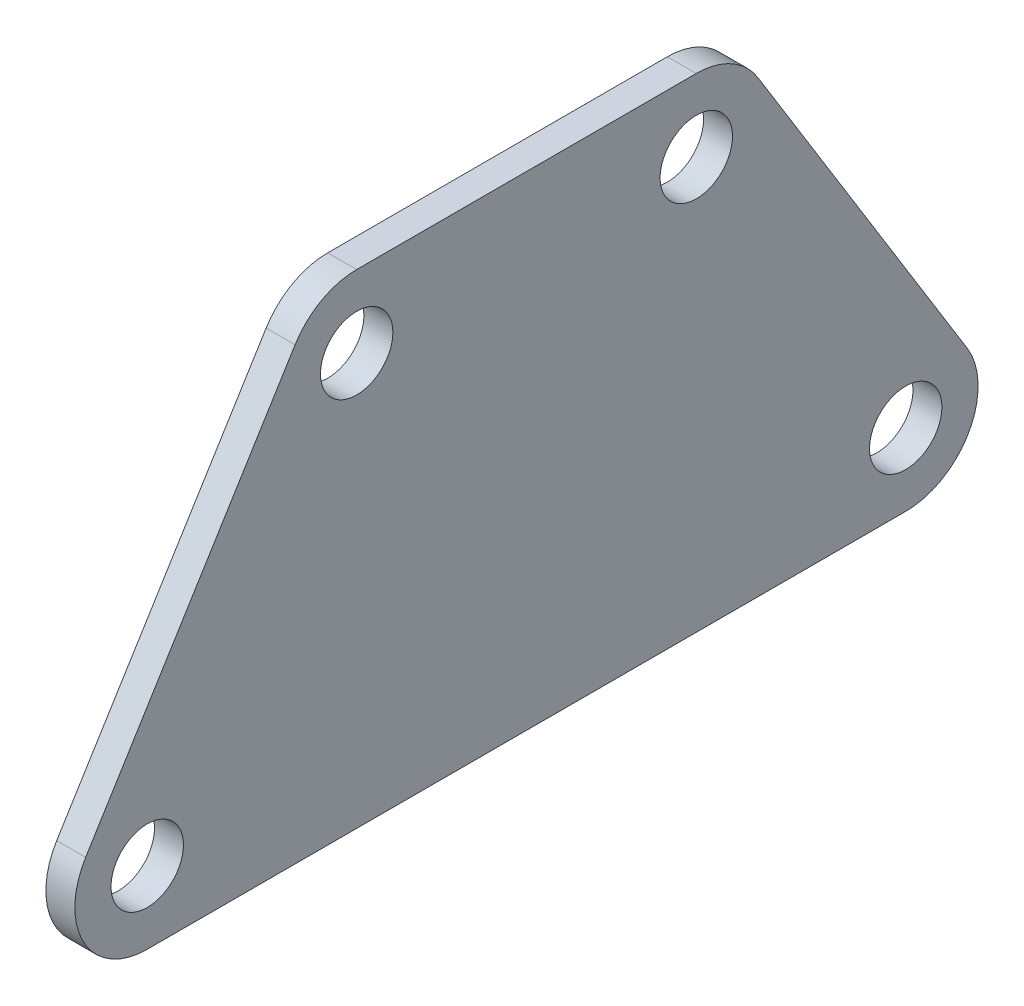
ISO-10303-21;
HEADER;
FILE_DESCRIPTION(('STEP AP214'),'2;1');
FILE_NAME('part.step','',(''),(''),'','','');
FILE_SCHEMA(('AUTOMOTIVE_DESIGN { 1 0 10303 214 1 1 1 1 }'));
ENDSEC;
DATA;
#1=APPLICATION_CONTEXT('core data for automotive mechanical design processes');
#2=APPLICATION_PROTOCOL_DEFINITION('international standard','automotive_design',2000,#1);
#3=PRODUCT_CONTEXT('',#1,'mechanical');
#4=PRODUCT('Part','Part','',(#3));
#5=PRODUCT_RELATED_PRODUCT_CATEGORY('part','',(#4));
#6=PRODUCT_DEFINITION_FORMATION('','',#4);
#7=PRODUCT_DEFINITION_CONTEXT('part definition',#1,'design');
#8=PRODUCT_DEFINITION('design','',#6,#7);
#9=PRODUCT_DEFINITION_SHAPE('','',#8);
#10=(LENGTH_UNIT() NAMED_UNIT(*) SI_UNIT(.MILLI.,.METRE.));
#11=(NAMED_UNIT(*) PLANE_ANGLE_UNIT() SI_UNIT($,.RADIAN.));
#12=(NAMED_UNIT(*) SI_UNIT($,.STERADIAN.) SOLID_ANGLE_UNIT());
#13=UNCERTAINTY_MEASURE_WITH_UNIT(LENGTH_MEASURE(1.E-05),#10,'distance_accuracy_value','');
#14=(GEOMETRIC_REPRESENTATION_CONTEXT(3) GLOBAL_UNCERTAINTY_ASSIGNED_CONTEXT((#13)) GLOBAL_UNIT_ASSIGNED_CONTEXT((#10,
#11,#12)) REPRESENTATION_CONTEXT('',''));
#15=CARTESIAN_POINT('',(0.,0.,0.));
#16=DIRECTION('',(0.,0.,1.));
#17=DIRECTION('',(1.,0.,0.));
#18=AXIS2_PLACEMENT_3D('',#15,#16,#17);
#19=CARTESIAN_POINT('',(4.,-10.7273584905661,-39.2383464398386));
#20=DIRECTION('',(-1.,0.,0.));
#21=DIRECTION('',(0.,0.,1.));
#22=AXIS2_PLACEMENT_3D('',#19,#20,#21);
#23=PLANE('',#22);
#24=CARTESIAN_POINT('',(4.,-10.7273584905661,-39.2383464398386));
#25=DIRECTION('',(1.,0.,0.));
#26=DIRECTION('',(0.,0.,1.));
#27=AXIS2_PLACEMENT_3D('',#24,#25,#26);
#28=CIRCLE('',#27,10.);
#29=CARTESIAN_POINT('',(4.,-20.7273584905661,-39.2383464398386));
#30=VERTEX_POINT('',#29);
#31=CARTESIAN_POINT('',(4.,-5.47397111629194,-47.7472782820746));
#32=VERTEX_POINT('',#31);
#33=EDGE_CURVE('E145',#30,#32,#28,.T.);
#34=ORIENTED_EDGE('',*,*,#33,.T.);
#35=DIRECTION('',(0.,0.850893184223597,0.525338737427412));
#36=VECTOR('',#35,1.);
#37=CARTESIAN_POINT('',(4.,41.3807458648402,-18.8193254934453));
#38=LINE('',#37,#36);
#39=CARTESIAN_POINT('',(4.,41.3807458648402,-18.8193254934453));
#40=VERTEX_POINT('',#39);
#41=EDGE_CURVE('E93',#32,#40,#38,.T.);
#42=ORIENTED_EDGE('',*,*,#41,.T.);
#43=CARTESIAN_POINT('',(4.,36.127358490566,-10.3103936512094));
#44=DIRECTION('',(1.,0.,0.));
#45=DIRECTION('',(0.,0.,1.));
#46=AXIS2_PLACEMENT_3D('',#43,#44,#45);
#47=CIRCLE('',#46,10.);
#48=CARTESIAN_POINT('',(4.,46.127358490566,-10.3103936512094));
#49=VERTEX_POINT('',#48);
#50=EDGE_CURVE('E160',#40,#49,#47,.T.);
#51=ORIENTED_EDGE('',*,*,#50,.T.);
#52=DIRECTION('',(0.,0.,1.));
#53=VECTOR('',#52,1.);
#54=CARTESIAN_POINT('',(4.,46.127358490566,36.6067928029435));
#55=LINE('',#54,#53);
#56=CARTESIAN_POINT('',(4.,46.127358490566,36.6067928029435));
#57=VERTEX_POINT('',#56);
#58=EDGE_CURVE('E173',#49,#57,#55,.T.);
#59=ORIENTED_EDGE('',*,*,#58,.T.);
#60=CARTESIAN_POINT('',(4.,36.127358490566,36.6067928029435));
#61=DIRECTION('',(1.,0.,0.));
#62=DIRECTION('',(0.,0.,-1.));
#63=AXIS2_PLACEMENT_3D('',#60,#61,#62);
#64=CIRCLE('',#63,10.);
#65=CARTESIAN_POINT('',(4.,41.3807458648402,45.1157246451795));
#66=VERTEX_POINT('',#65);
#67=EDGE_CURVE('E112',#57,#66,#64,.T.);
#68=ORIENTED_EDGE('',*,*,#67,.T.);
#69=DIRECTION('',(0.,-0.850893184223598,0.525338737427412));
#70=VECTOR('',#69,1.);
#71=CARTESIAN_POINT('',(4.,-5.47397111629194,74.0436774338087));
#72=LINE('',#71,#70);
#73=CARTESIAN_POINT('',(4.,-5.47397111629194,74.0436774338087));
#74=VERTEX_POINT('',#73);
#75=EDGE_CURVE('E106',#66,#74,#72,.T.);
#76=ORIENTED_EDGE('',*,*,#75,.T.);
#77=CARTESIAN_POINT('',(4.,-10.7273584905661,65.5347455915727));
#78=DIRECTION('',(1.,0.,0.));
#79=DIRECTION('',(0.,0.,-1.));
#80=AXIS2_PLACEMENT_3D('',#77,#78,#79);
#81=CIRCLE('',#80,10.);
#82=CARTESIAN_POINT('',(4.,-20.7273584905661,65.5347455915727));
#83=VERTEX_POINT('',#82);
#84=EDGE_CURVE('E110',#74,#83,#81,.T.);
#85=ORIENTED_EDGE('',*,*,#84,.T.);
#86=DIRECTION('',(0.,0.,-1.));
#87=VECTOR('',#86,1.);
#88=CARTESIAN_POINT('',(4.,-20.7273584905661,-39.2383464398386));
#89=LINE('',#88,#87);
#90=EDGE_CURVE('E50',#83,#30,#89,.T.);
#91=ORIENTED_EDGE('',*,*,#90,.T.);
#92=EDGE_LOOP('',(#34,#42,#51,#59,#68,#76,#85,#91));
#93=FACE_BOUND('',#92,.T.);
#94=CARTESIAN_POINT('',(4.,36.127358490566,36.6067928029435));
#95=DIRECTION('',(1.,0.,0.));
#96=DIRECTION('',(0.,0.,-1.));
#97=AXIS2_PLACEMENT_3D('',#94,#95,#96);
#98=CIRCLE('',#97,5.);
#99=CARTESIAN_POINT('',(4.,36.127358490566,31.6067928029435));
#100=VERTEX_POINT('',#99);
#101=EDGE_CURVE('E134',#100,#100,#98,.T.);
#102=ORIENTED_EDGE('',*,*,#101,.F.);
#103=EDGE_LOOP('',(#102));
#104=FACE_BOUND('',#103,.T.);
#105=CARTESIAN_POINT('',(4.,36.127358490566,-10.3103936512094));
#106=DIRECTION('',(1.,0.,0.));
#107=DIRECTION('',(0.,0.,-1.));
#108=AXIS2_PLACEMENT_3D('',#105,#106,#107);
#109=CIRCLE('',#108,4.99999999999999);
#110=CARTESIAN_POINT('',(4.,36.127358490566,-15.3103936512094));
#111=VERTEX_POINT('',#110);
#112=EDGE_CURVE('E182',#111,#111,#109,.T.);
#113=ORIENTED_EDGE('',*,*,#112,.F.);
#114=EDGE_LOOP('',(#113));
#115=FACE_BOUND('',#114,.T.);
#116=CARTESIAN_POINT('',(4.,-10.7273584905661,-39.2383464398386));
#117=DIRECTION('',(1.,0.,0.));
#118=DIRECTION('',(0.,0.,-1.));
#119=AXIS2_PLACEMENT_3D('',#116,#117,#118);
#120=CIRCLE('',#119,4.99999999999999);
#121=CARTESIAN_POINT('',(4.,-10.7273584905661,-44.2383464398386));
#122=VERTEX_POINT('',#121);
#123=EDGE_CURVE('E188',#122,#122,#120,.T.);
#124=ORIENTED_EDGE('',*,*,#123,.F.);
#125=EDGE_LOOP('',(#124));
#126=FACE_BOUND('',#125,.T.);
#127=CARTESIAN_POINT('',(4.,-10.7273584905661,65.5347455915727));
#128=DIRECTION('',(1.,0.,0.));
#129=DIRECTION('',(0.,0.,-1.));
#130=AXIS2_PLACEMENT_3D('',#127,#128,#129);
#131=CIRCLE('',#130,4.99999999999999);
#132=CARTESIAN_POINT('',(4.,-10.7273584905661,60.5347455915728));
#133=VERTEX_POINT('',#132);
#134=EDGE_CURVE('E194',#133,#133,#131,.T.);
#135=ORIENTED_EDGE('',*,*,#134,.F.);
#136=EDGE_LOOP('',(#135));
#137=FACE_BOUND('',#136,.T.);
#138=ADVANCED_FACE('F33',(#93,#104,#115,#126,#137),#23,.F.);
#139=CARTESIAN_POINT('',(0.,-10.7273584905661,-39.2383464398386));
#140=DIRECTION('',(-1.,0.,0.));
#141=DIRECTION('',(0.,0.,1.));
#142=AXIS2_PLACEMENT_3D('',#139,#140,#141);
#143=PLANE('',#142);
#144=CARTESIAN_POINT('',(0.,-10.7273584905661,-39.2383464398386));
#145=DIRECTION('',(1.,0.,0.));
#146=DIRECTION('',(0.,0.,-1.));
#147=AXIS2_PLACEMENT_3D('',#144,#145,#146);
#148=CIRCLE('',#147,4.99999999999999);
#149=CARTESIAN_POINT('',(0.,-10.7273584905661,-44.2383464398386));
#150=VERTEX_POINT('',#149);
#151=EDGE_CURVE('E191',#150,#150,#148,.T.);
#152=ORIENTED_EDGE('',*,*,#151,.T.);
#153=EDGE_LOOP('',(#152));
#154=FACE_BOUND('',#153,.T.);
#155=CARTESIAN_POINT('',(0.,36.127358490566,36.6067928029435));
#156=DIRECTION('',(1.,0.,0.));
#157=DIRECTION('',(0.,0.,-1.));
#158=AXIS2_PLACEMENT_3D('',#155,#156,#157);
#159=CIRCLE('',#158,5.);
#160=CARTESIAN_POINT('',(0.,36.127358490566,31.6067928029435));
#161=VERTEX_POINT('',#160);
#162=EDGE_CURVE('E179',#161,#161,#159,.T.);
#163=ORIENTED_EDGE('',*,*,#162,.T.);
#164=EDGE_LOOP('',(#163));
#165=FACE_BOUND('',#164,.T.);
#166=CARTESIAN_POINT('',(0.,-10.7273584905661,-39.2383464398386));
#167=DIRECTION('',(1.,0.,0.));
#168=DIRECTION('',(0.,0.,1.));
#169=AXIS2_PLACEMENT_3D('',#166,#167,#168);
#170=CIRCLE('',#169,10.);
#171=CARTESIAN_POINT('',(0.,-20.7273584905661,-39.2383464398386));
#172=VERTEX_POINT('',#171);
#173=CARTESIAN_POINT('',(0.,-5.47397111629194,-47.7472782820746));
#174=VERTEX_POINT('',#173);
#175=EDGE_CURVE('E130',#172,#174,#170,.T.);
#176=ORIENTED_EDGE('',*,*,#175,.F.);
#177=DIRECTION('',(0.,0.,-1.));
#178=VECTOR('',#177,1.);
#179=CARTESIAN_POINT('',(0.,-20.7273584905661,-39.2383464398386));
#180=LINE('',#179,#178);
#181=CARTESIAN_POINT('',(0.,-20.7273584905661,65.5347455915727));
#182=VERTEX_POINT('',#181);
#183=EDGE_CURVE('E85',#182,#172,#180,.T.);
#184=ORIENTED_EDGE('',*,*,#183,.F.);
#185=CARTESIAN_POINT('',(0.,-10.7273584905661,65.5347455915727));
#186=DIRECTION('',(1.,0.,0.));
#187=DIRECTION('',(0.,0.,-1.));
#188=AXIS2_PLACEMENT_3D('',#185,#186,#187);
#189=CIRCLE('',#188,10.);
#190=CARTESIAN_POINT('',(0.,-5.47397111629194,74.0436774338087));
#191=VERTEX_POINT('',#190);
#192=EDGE_CURVE('E79',#191,#182,#189,.T.);
#193=ORIENTED_EDGE('',*,*,#192,.F.);
#194=DIRECTION('',(0.,-0.850893184223598,0.525338737427412));
#195=VECTOR('',#194,1.);
#196=CARTESIAN_POINT('',(0.,-5.47397111629194,74.0436774338087));
#197=LINE('',#196,#195);
#198=CARTESIAN_POINT('',(0.,41.3807458648402,45.1157246451795));
#199=VERTEX_POINT('',#198);
#200=EDGE_CURVE('E120',#199,#191,#197,.T.);
#201=ORIENTED_EDGE('',*,*,#200,.F.);
#202=CARTESIAN_POINT('',(0.,36.127358490566,36.6067928029435));
#203=DIRECTION('',(1.,0.,0.));
#204=DIRECTION('',(0.,0.,-1.));
#205=AXIS2_PLACEMENT_3D('',#202,#203,#204);
#206=CIRCLE('',#205,10.);
#207=CARTESIAN_POINT('',(0.,46.127358490566,36.6067928029435));
#208=VERTEX_POINT('',#207);
#209=EDGE_CURVE('E140',#208,#199,#206,.T.);
#210=ORIENTED_EDGE('',*,*,#209,.F.);
#211=DIRECTION('',(0.,0.,1.));
#212=VECTOR('',#211,1.);
#213=CARTESIAN_POINT('',(0.,46.127358490566,36.6067928029435));
#214=LINE('',#213,#212);
#215=CARTESIAN_POINT('',(0.,46.127358490566,-10.3103936512094));
#216=VERTEX_POINT('',#215);
#217=EDGE_CURVE('E138',#216,#208,#214,.T.);
#218=ORIENTED_EDGE('',*,*,#217,.F.);
#219=CARTESIAN_POINT('',(0.,36.127358490566,-10.3103936512094));
#220=DIRECTION('',(1.,0.,0.));
#221=DIRECTION('',(0.,0.,1.));
#222=AXIS2_PLACEMENT_3D('',#219,#220,#221);
#223=CIRCLE('',#222,10.);
#224=CARTESIAN_POINT('',(0.,41.3807458648402,-18.8193254934453));
#225=VERTEX_POINT('',#224);
#226=EDGE_CURVE('E136',#225,#216,#223,.T.);
#227=ORIENTED_EDGE('',*,*,#226,.F.);
#228=DIRECTION('',(0.,0.850893184223597,0.525338737427412));
#229=VECTOR('',#228,1.);
#230=CARTESIAN_POINT('',(0.,41.3807458648402,-18.8193254934453));
#231=LINE('',#230,#229);
#232=EDGE_CURVE('E133',#174,#225,#231,.T.);
#233=ORIENTED_EDGE('',*,*,#232,.F.);
#234=EDGE_LOOP('',(#176,#184,#193,#201,#210,#218,#227,#233));
#235=FACE_BOUND('',#234,.T.);
#236=CARTESIAN_POINT('',(0.,36.127358490566,-10.3103936512094));
#237=DIRECTION('',(1.,0.,0.));
#238=DIRECTION('',(0.,0.,-1.));
#239=AXIS2_PLACEMENT_3D('',#236,#237,#238);
#240=CIRCLE('',#239,4.99999999999999);
#241=CARTESIAN_POINT('',(0.,36.127358490566,-15.3103936512094));
#242=VERTEX_POINT('',#241);
#243=EDGE_CURVE('E185',#242,#242,#240,.T.);
#244=ORIENTED_EDGE('',*,*,#243,.T.);
#245=EDGE_LOOP('',(#244));
#246=FACE_BOUND('',#245,.T.);
#247=CARTESIAN_POINT('',(0.,-10.7273584905661,65.5347455915727));
#248=DIRECTION('',(1.,0.,0.));
#249=DIRECTION('',(0.,0.,-1.));
#250=AXIS2_PLACEMENT_3D('',#247,#248,#249);
#251=CIRCLE('',#250,4.99999999999999);
#252=CARTESIAN_POINT('',(0.,-10.7273584905661,60.5347455915728));
#253=VERTEX_POINT('',#252);
#254=EDGE_CURVE('E197',#253,#253,#251,.T.);
#255=ORIENTED_EDGE('',*,*,#254,.T.);
#256=EDGE_LOOP('',(#255));
#257=FACE_BOUND('',#256,.T.);
#258=ADVANCED_FACE('F164',(#154,#165,#235,#246,#257),#143,.T.);
#259=CARTESIAN_POINT('',(4.,-10.7273584905661,-39.2383464398386));
#260=DIRECTION('',(-1.,0.,0.));
#261=DIRECTION('',(0.,0.,1.));
#262=AXIS2_PLACEMENT_3D('',#259,#260,#261);
#263=CYLINDRICAL_SURFACE('',#262,10.);
#264=ORIENTED_EDGE('',*,*,#175,.T.);
#265=DIRECTION('',(-1.,0.,0.));
#266=VECTOR('',#265,1.);
#267=CARTESIAN_POINT('',(4.,-5.47397111629194,-47.7472782820746));
#268=LINE('',#267,#266);
#269=EDGE_CURVE('E11',#32,#174,#268,.T.);
#270=ORIENTED_EDGE('',*,*,#269,.F.);
#271=ORIENTED_EDGE('',*,*,#33,.F.);
#272=DIRECTION('',(-1.,0.,0.));
#273=VECTOR('',#272,1.);
#274=CARTESIAN_POINT('',(4.,-20.7273584905661,-39.2383464398386));
#275=LINE('',#274,#273);
#276=EDGE_CURVE('E126',#30,#172,#275,.T.);
#277=ORIENTED_EDGE('',*,*,#276,.T.);
#278=EDGE_LOOP('',(#264,#270,#271,#277));
#279=FACE_BOUND('',#278,.T.);
#280=ADVANCED_FACE('F35',(#279),#263,.T.);
#281=CARTESIAN_POINT('',(4.,41.3807458648402,-18.8193254934453));
#282=DIRECTION('',(0.,-0.525338737427412,0.850893184223598));
#283=DIRECTION('',(0.,-0.850893184223597,-0.525338737427412));
#284=AXIS2_PLACEMENT_3D('',#281,#282,#283);
#285=PLANE('',#284);
#286=ORIENTED_EDGE('',*,*,#232,.T.);
#287=DIRECTION('',(-1.,0.,0.));
#288=VECTOR('',#287,1.);
#289=CARTESIAN_POINT('',(4.,41.3807458648402,-18.8193254934453));
#290=LINE('',#289,#288);
#291=EDGE_CURVE('E42',#40,#225,#290,.T.);
#292=ORIENTED_EDGE('',*,*,#291,.F.);
#293=ORIENTED_EDGE('',*,*,#41,.F.);
#294=ORIENTED_EDGE('',*,*,#269,.T.);
#295=EDGE_LOOP('',(#286,#292,#293,#294));
#296=FACE_BOUND('',#295,.T.);
#297=ADVANCED_FACE('F229',(#296),#285,.F.);
#298=CARTESIAN_POINT('',(4.,36.127358490566,-10.3103936512094));
#299=DIRECTION('',(-1.,0.,0.));
#300=DIRECTION('',(0.,0.,1.));
#301=AXIS2_PLACEMENT_3D('',#298,#299,#300);
#302=CYLINDRICAL_SURFACE('',#301,10.);
#303=ORIENTED_EDGE('',*,*,#226,.T.);
#304=DIRECTION('',(-1.,0.,0.));
#305=VECTOR('',#304,1.);
#306=CARTESIAN_POINT('',(4.,46.127358490566,-10.3103936512094));
#307=LINE('',#306,#305);
#308=EDGE_CURVE('E152',#49,#216,#307,.T.);
#309=ORIENTED_EDGE('',*,*,#308,.F.);
#310=ORIENTED_EDGE('',*,*,#50,.F.);
#311=ORIENTED_EDGE('',*,*,#291,.T.);
#312=EDGE_LOOP('',(#303,#309,#310,#311));
#313=FACE_BOUND('',#312,.T.);
#314=ADVANCED_FACE('F158',(#313),#302,.T.);
#315=CARTESIAN_POINT('',(4.,46.127358490566,36.6067928029435));
#316=DIRECTION('',(0.,-1.,0.));
#317=DIRECTION('',(0.,0.,-1.));
#318=AXIS2_PLACEMENT_3D('',#315,#316,#317);
#319=PLANE('',#318);
#320=ORIENTED_EDGE('',*,*,#217,.T.);
#321=DIRECTION('',(-1.,0.,0.));
#322=VECTOR('',#321,1.);
#323=CARTESIAN_POINT('',(4.,46.127358490566,36.6067928029435));
#324=LINE('',#323,#322);
#325=EDGE_CURVE('E149',#57,#208,#324,.T.);
#326=ORIENTED_EDGE('',*,*,#325,.F.);
#327=ORIENTED_EDGE('',*,*,#58,.F.);
#328=ORIENTED_EDGE('',*,*,#308,.T.);
#329=EDGE_LOOP('',(#320,#326,#327,#328));
#330=FACE_BOUND('',#329,.T.);
#331=ADVANCED_FACE('F169',(#330),#319,.F.);
#332=CARTESIAN_POINT('',(4.,36.127358490566,36.6067928029435));
#333=DIRECTION('',(-1.,0.,0.));
#334=DIRECTION('',(0.,0.,1.));
#335=AXIS2_PLACEMENT_3D('',#332,#333,#334);
#336=CYLINDRICAL_SURFACE('',#335,10.);
#337=ORIENTED_EDGE('',*,*,#209,.T.);
#338=DIRECTION('',(-1.,0.,0.));
#339=VECTOR('',#338,1.);
#340=CARTESIAN_POINT('',(4.,41.3807458648402,45.1157246451795));
#341=LINE('',#340,#339);
#342=EDGE_CURVE('E121',#66,#199,#341,.T.);
#343=ORIENTED_EDGE('',*,*,#342,.F.);
#344=ORIENTED_EDGE('',*,*,#67,.F.);
#345=ORIENTED_EDGE('',*,*,#325,.T.);
#346=EDGE_LOOP('',(#337,#343,#344,#345));
#347=FACE_BOUND('',#346,.T.);
#348=ADVANCED_FACE('F172',(#347),#336,.T.);
#349=CARTESIAN_POINT('',(4.,-5.47397111629194,74.0436774338087));
#350=DIRECTION('',(0.,-0.525338737427412,-0.850893184223598));
#351=DIRECTION('',(0.,0.850893184223597,-0.525338737427411));
#352=AXIS2_PLACEMENT_3D('',#349,#350,#351);
#353=PLANE('',#352);
#354=ORIENTED_EDGE('',*,*,#200,.T.);
#355=DIRECTION('',(-1.,0.,0.));
#356=VECTOR('',#355,1.);
#357=CARTESIAN_POINT('',(4.,-5.47397111629194,74.0436774338087));
#358=LINE('',#357,#356);
#359=EDGE_CURVE('E117',#74,#191,#358,.T.);
#360=ORIENTED_EDGE('',*,*,#359,.F.);
#361=ORIENTED_EDGE('',*,*,#75,.F.);
#362=ORIENTED_EDGE('',*,*,#342,.T.);
#363=EDGE_LOOP('',(#354,#360,#361,#362));
#364=FACE_BOUND('',#363,.T.);
#365=ADVANCED_FACE('F118',(#364),#353,.F.);
#366=CARTESIAN_POINT('',(4.,-10.7273584905661,65.5347455915727));
#367=DIRECTION('',(-1.,0.,0.));
#368=DIRECTION('',(0.,0.,1.));
#369=AXIS2_PLACEMENT_3D('',#366,#367,#368);
#370=CYLINDRICAL_SURFACE('',#369,10.);
#371=ORIENTED_EDGE('',*,*,#192,.T.);
#372=DIRECTION('',(-1.,0.,0.));
#373=VECTOR('',#372,1.);
#374=CARTESIAN_POINT('',(4.,-20.7273584905661,65.5347455915727));
#375=LINE('',#374,#373);
#376=EDGE_CURVE('E122',#83,#182,#375,.T.);
#377=ORIENTED_EDGE('',*,*,#376,.F.);
#378=ORIENTED_EDGE('',*,*,#84,.F.);
#379=ORIENTED_EDGE('',*,*,#359,.T.);
#380=EDGE_LOOP('',(#371,#377,#378,#379));
#381=FACE_BOUND('',#380,.T.);
#382=ADVANCED_FACE('F124',(#381),#370,.T.);
#383=CARTESIAN_POINT('',(4.,-20.7273584905661,-39.2383464398386));
#384=DIRECTION('',(0.,1.,0.));
#385=DIRECTION('',(0.,0.,1.));
#386=AXIS2_PLACEMENT_3D('',#383,#384,#385);
#387=PLANE('',#386);
#388=ORIENTED_EDGE('',*,*,#183,.T.);
#389=ORIENTED_EDGE('',*,*,#276,.F.);
#390=ORIENTED_EDGE('',*,*,#90,.F.);
#391=ORIENTED_EDGE('',*,*,#376,.T.);
#392=EDGE_LOOP('',(#388,#389,#390,#391));
#393=FACE_BOUND('',#392,.T.);
#394=ADVANCED_FACE('F217',(#393),#387,.F.);
#395=CARTESIAN_POINT('',(4.,36.127358490566,36.6067928029435));
#396=DIRECTION('',(-1.,0.,0.));
#397=DIRECTION('',(0.,0.,1.));
#398=AXIS2_PLACEMENT_3D('',#395,#396,#397);
#399=CYLINDRICAL_SURFACE('',#398,5.);
#400=ORIENTED_EDGE('',*,*,#101,.T.);
#401=EDGE_LOOP('',(#400));
#402=FACE_BOUND('',#401,.T.);
#403=ORIENTED_EDGE('',*,*,#162,.F.);
#404=EDGE_LOOP('',(#403));
#405=FACE_BOUND('',#404,.T.);
#406=ADVANCED_FACE('F214',(#402,#405),#399,.F.);
#407=CARTESIAN_POINT('',(4.,36.127358490566,-10.3103936512094));
#408=DIRECTION('',(-1.,0.,0.));
#409=DIRECTION('',(0.,0.,1.));
#410=AXIS2_PLACEMENT_3D('',#407,#408,#409);
#411=CYLINDRICAL_SURFACE('',#410,4.99999999999999);
#412=ORIENTED_EDGE('',*,*,#112,.T.);
#413=EDGE_LOOP('',(#412));
#414=FACE_BOUND('',#413,.T.);
#415=ORIENTED_EDGE('',*,*,#243,.F.);
#416=EDGE_LOOP('',(#415));
#417=FACE_BOUND('',#416,.T.);
#418=ADVANCED_FACE('F293',(#414,#417),#411,.F.);
#419=CARTESIAN_POINT('',(4.,-10.7273584905661,-39.2383464398386));
#420=DIRECTION('',(-1.,0.,0.));
#421=DIRECTION('',(0.,0.,1.));
#422=AXIS2_PLACEMENT_3D('',#419,#420,#421);
#423=CYLINDRICAL_SURFACE('',#422,4.99999999999999);
#424=ORIENTED_EDGE('',*,*,#123,.T.);
#425=EDGE_LOOP('',(#424));
#426=FACE_BOUND('',#425,.T.);
#427=ORIENTED_EDGE('',*,*,#151,.F.);
#428=EDGE_LOOP('',(#427));
#429=FACE_BOUND('',#428,.T.);
#430=ADVANCED_FACE('F301',(#426,#429),#423,.F.);
#431=CARTESIAN_POINT('',(4.,-10.7273584905661,65.5347455915727));
#432=DIRECTION('',(-1.,0.,0.));
#433=DIRECTION('',(0.,0.,1.));
#434=AXIS2_PLACEMENT_3D('',#431,#432,#433);
#435=CYLINDRICAL_SURFACE('',#434,4.99999999999999);
#436=ORIENTED_EDGE('',*,*,#134,.T.);
#437=EDGE_LOOP('',(#436));
#438=FACE_BOUND('',#437,.T.);
#439=ORIENTED_EDGE('',*,*,#254,.F.);
#440=EDGE_LOOP('',(#439));
#441=FACE_BOUND('',#440,.T.);
#442=ADVANCED_FACE('F203',(#438,#441),#435,.F.);
#443=CLOSED_SHELL('',(#138,#258,#280,#297,#314,#331,#348,#365,#382,#394,#406,#418,#430,#442));
#444=MANIFOLD_SOLID_BREP('B2',#443);
#445=ADVANCED_BREP_SHAPE_REPRESENTATION('',(#18,#444),#14);
#446=SHAPE_DEFINITION_REPRESENTATION(#9,#445);
ENDSEC;
END-ISO-10303-21;
